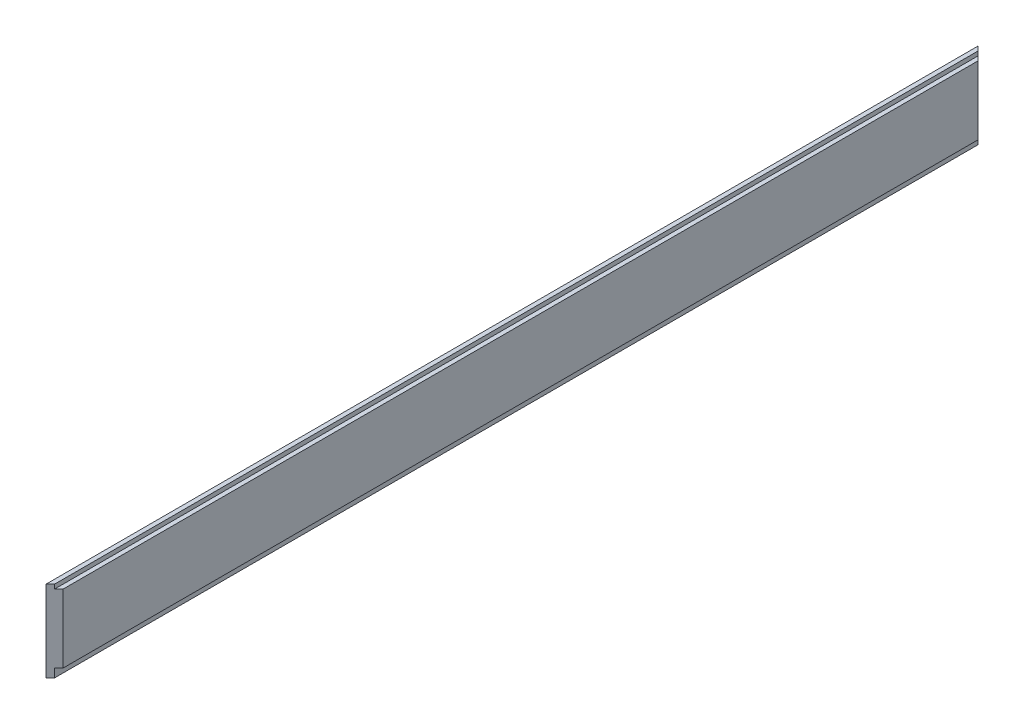
ISO-10303-21;
HEADER;
FILE_DESCRIPTION(('STEP AP214'),'2;1');
FILE_NAME('part.step','',(''),(''),'','','');
FILE_SCHEMA(('AUTOMOTIVE_DESIGN { 1 0 10303 214 1 1 1 1 }'));
ENDSEC;
DATA;
#1=APPLICATION_CONTEXT('core data for automotive mechanical design processes');
#2=APPLICATION_PROTOCOL_DEFINITION('international standard','automotive_design',2000,#1);
#3=PRODUCT_CONTEXT('',#1,'mechanical');
#4=PRODUCT('Part','Part','',(#3));
#5=PRODUCT_RELATED_PRODUCT_CATEGORY('part','',(#4));
#6=PRODUCT_DEFINITION_FORMATION('','',#4);
#7=PRODUCT_DEFINITION_CONTEXT('part definition',#1,'design');
#8=PRODUCT_DEFINITION('design','',#6,#7);
#9=PRODUCT_DEFINITION_SHAPE('','',#8);
#10=(LENGTH_UNIT() NAMED_UNIT(*) SI_UNIT(.MILLI.,.METRE.));
#11=(NAMED_UNIT(*) PLANE_ANGLE_UNIT() SI_UNIT($,.RADIAN.));
#12=(NAMED_UNIT(*) SI_UNIT($,.STERADIAN.) SOLID_ANGLE_UNIT());
#13=UNCERTAINTY_MEASURE_WITH_UNIT(LENGTH_MEASURE(1.E-05),#10,'distance_accuracy_value','');
#14=(GEOMETRIC_REPRESENTATION_CONTEXT(3) GLOBAL_UNCERTAINTY_ASSIGNED_CONTEXT((#13)) GLOBAL_UNIT_ASSIGNED_CONTEXT((#10,
#11,#12)) REPRESENTATION_CONTEXT('',''));
#15=CARTESIAN_POINT('',(0.,0.,0.));
#16=DIRECTION('',(0.,0.,1.));
#17=DIRECTION('',(1.,0.,0.));
#18=AXIS2_PLACEMENT_3D('',#15,#16,#17);
#19=CARTESIAN_POINT('',(3.175,0.,692.15));
#20=DIRECTION('',(0.,-1.,0.));
#21=DIRECTION('',(1.,0.,0.));
#22=AXIS2_PLACEMENT_3D('',#19,#20,#21);
#23=PLANE('',#22);
#24=DIRECTION('',(0.,0.,-1.));
#25=VECTOR('',#24,1.);
#26=CARTESIAN_POINT('',(3.175,0.,692.15));
#27=LINE('',#26,#25);
#28=CARTESIAN_POINT('',(3.175,0.,688.975));
#29=VERTEX_POINT('',#28);
#30=CARTESIAN_POINT('',(3.17500000000001,0.,3.17500000000004));
#31=VERTEX_POINT('',#30);
#32=EDGE_CURVE('E11',#29,#31,#27,.T.);
#33=ORIENTED_EDGE('',*,*,#32,.F.);
#34=DIRECTION('',(0.707106781186547,0.,-0.707106781186548));
#35=VECTOR('',#34,1.);
#36=CARTESIAN_POINT('',(0.,0.,692.15));
#37=LINE('',#36,#35);
#38=CARTESIAN_POINT('',(0.,0.,692.15));
#39=VERTEX_POINT('',#38);
#40=EDGE_CURVE('E102',#39,#29,#37,.T.);
#41=ORIENTED_EDGE('',*,*,#40,.F.);
#42=DIRECTION('',(0.,0.,-1.));
#43=VECTOR('',#42,1.);
#44=CARTESIAN_POINT('',(0.,0.,692.15));
#45=LINE('',#44,#43);
#46=CARTESIAN_POINT('',(0.,0.,0.));
#47=VERTEX_POINT('',#46);
#48=EDGE_CURVE('E42',#39,#47,#45,.T.);
#49=ORIENTED_EDGE('',*,*,#48,.T.);
#50=DIRECTION('',(0.707106781186547,0.,0.707106781186548));
#51=VECTOR('',#50,1.);
#52=CARTESIAN_POINT('',(0.,0.,0.));
#53=LINE('',#52,#51);
#54=EDGE_CURVE('E159',#47,#31,#53,.T.);
#55=ORIENTED_EDGE('',*,*,#54,.T.);
#56=EDGE_LOOP('',(#33,#41,#49,#55));
#57=FACE_BOUND('',#56,.T.);
#58=ADVANCED_FACE('F39',(#57),#23,.T.);
#59=CARTESIAN_POINT('',(3.175,6.35,692.15));
#60=DIRECTION('',(1.,0.,0.));
#61=DIRECTION('',(0.,1.,0.));
#62=AXIS2_PLACEMENT_3D('',#59,#60,#61);
#63=PLANE('',#62);
#64=DIRECTION('',(0.,0.,-1.));
#65=VECTOR('',#64,1.);
#66=CARTESIAN_POINT('',(3.175,6.35,692.15));
#67=LINE('',#66,#65);
#68=CARTESIAN_POINT('',(3.175,6.35,688.975));
#69=VERTEX_POINT('',#68);
#70=CARTESIAN_POINT('',(3.17500000000004,6.35,3.17499999999998));
#71=VERTEX_POINT('',#70);
#72=EDGE_CURVE('E49',#69,#71,#67,.T.);
#73=ORIENTED_EDGE('',*,*,#72,.F.);
#74=DIRECTION('',(0.,-1.,0.));
#75=VECTOR('',#74,1.);
#76=CARTESIAN_POINT('',(3.175,6.35,688.975));
#77=LINE('',#76,#75);
#78=EDGE_CURVE('E164',#69,#29,#77,.T.);
#79=ORIENTED_EDGE('',*,*,#78,.T.);
#80=ORIENTED_EDGE('',*,*,#32,.T.);
#81=DIRECTION('',(0.,-1.,0.));
#82=VECTOR('',#81,1.);
#83=CARTESIAN_POINT('',(3.175,6.34999999999995,3.17500000000004));
#84=LINE('',#83,#82);
#85=EDGE_CURVE('E138',#71,#31,#84,.T.);
#86=ORIENTED_EDGE('',*,*,#85,.F.);
#87=EDGE_LOOP('',(#73,#79,#80,#86));
#88=FACE_BOUND('',#87,.T.);
#89=ADVANCED_FACE('F209',(#88),#63,.T.);
#90=CARTESIAN_POINT('',(6.35,6.35,692.15));
#91=DIRECTION('',(0.,-1.,0.));
#92=DIRECTION('',(1.,0.,0.));
#93=AXIS2_PLACEMENT_3D('',#90,#91,#92);
#94=PLANE('',#93);
#95=DIRECTION('',(0.,0.,-1.));
#96=VECTOR('',#95,1.);
#97=CARTESIAN_POINT('',(6.35,6.35,692.15));
#98=LINE('',#97,#96);
#99=CARTESIAN_POINT('',(6.34999999999999,6.35,685.8));
#100=VERTEX_POINT('',#99);
#101=CARTESIAN_POINT('',(6.34999999999999,6.35,6.35));
#102=VERTEX_POINT('',#101);
#103=EDGE_CURVE('E132',#100,#102,#98,.T.);
#104=ORIENTED_EDGE('',*,*,#103,.F.);
#105=DIRECTION('',(-0.707106781186547,0.,0.707106781186548));
#106=VECTOR('',#105,1.);
#107=CARTESIAN_POINT('',(3.175,6.35,688.975));
#108=LINE('',#107,#106);
#109=EDGE_CURVE('E169',#100,#69,#108,.T.);
#110=ORIENTED_EDGE('',*,*,#109,.T.);
#111=ORIENTED_EDGE('',*,*,#72,.T.);
#112=DIRECTION('',(-0.707106781186547,0.,-0.707106781186548));
#113=VECTOR('',#112,1.);
#114=CARTESIAN_POINT('',(349.25,6.35000000000009,349.25));
#115=LINE('',#114,#113);
#116=EDGE_CURVE('E143',#102,#71,#115,.T.);
#117=ORIENTED_EDGE('',*,*,#116,.F.);
#118=EDGE_LOOP('',(#104,#110,#111,#117));
#119=FACE_BOUND('',#118,.T.);
#120=ADVANCED_FACE('F206',(#119),#94,.T.);
#121=CARTESIAN_POINT('',(6.34999999999999,57.15,692.15));
#122=DIRECTION('',(1.,0.,0.));
#123=DIRECTION('',(0.,1.,0.));
#124=AXIS2_PLACEMENT_3D('',#121,#122,#123);
#125=PLANE('',#124);
#126=DIRECTION('',(0.,0.,-1.));
#127=VECTOR('',#126,1.);
#128=CARTESIAN_POINT('',(6.34999999999999,57.15,692.15));
#129=LINE('',#128,#127);
#130=CARTESIAN_POINT('',(6.34999999999999,57.15,685.8));
#131=VERTEX_POINT('',#130);
#132=CARTESIAN_POINT('',(6.34999999999999,57.15,6.35));
#133=VERTEX_POINT('',#132);
#134=EDGE_CURVE('E129',#131,#133,#129,.T.);
#135=ORIENTED_EDGE('',*,*,#134,.F.);
#136=DIRECTION('',(0.,1.,0.));
#137=VECTOR('',#136,1.);
#138=CARTESIAN_POINT('',(6.34999999999999,0.,685.8));
#139=LINE('',#138,#137);
#140=EDGE_CURVE('E116',#100,#131,#139,.T.);
#141=ORIENTED_EDGE('',*,*,#140,.F.);
#142=ORIENTED_EDGE('',*,*,#103,.T.);
#143=DIRECTION('',(0.,1.,0.));
#144=VECTOR('',#143,1.);
#145=CARTESIAN_POINT('',(6.34999999999999,0.,6.35));
#146=LINE('',#145,#144);
#147=EDGE_CURVE('E155',#102,#133,#146,.T.);
#148=ORIENTED_EDGE('',*,*,#147,.T.);
#149=EDGE_LOOP('',(#135,#141,#142,#148));
#150=FACE_BOUND('',#149,.T.);
#151=ADVANCED_FACE('F201',(#150),#125,.T.);
#152=CARTESIAN_POINT('',(3.17499999999999,57.15,692.15));
#153=DIRECTION('',(0.,1.,0.));
#154=DIRECTION('',(0.,0.,1.));
#155=AXIS2_PLACEMENT_3D('',#152,#153,#154);
#156=PLANE('',#155);
#157=DIRECTION('',(0.,0.,-1.));
#158=VECTOR('',#157,1.);
#159=CARTESIAN_POINT('',(3.17499999999999,57.15,692.15));
#160=LINE('',#159,#158);
#161=CARTESIAN_POINT('',(3.17499999999999,57.15,688.975));
#162=VERTEX_POINT('',#161);
#163=CARTESIAN_POINT('',(3.17499999999999,57.15,3.17500000000004));
#164=VERTEX_POINT('',#163);
#165=EDGE_CURVE('E124',#162,#164,#160,.T.);
#166=ORIENTED_EDGE('',*,*,#165,.F.);
#167=DIRECTION('',(0.707106781186547,0.,-0.707106781186548));
#168=VECTOR('',#167,1.);
#169=CARTESIAN_POINT('',(1.5875,57.15,690.5625));
#170=LINE('',#169,#168);
#171=EDGE_CURVE('E173',#162,#131,#170,.T.);
#172=ORIENTED_EDGE('',*,*,#171,.T.);
#173=ORIENTED_EDGE('',*,*,#134,.T.);
#174=DIRECTION('',(0.707106781186547,0.,0.707106781186548));
#175=VECTOR('',#174,1.);
#176=CARTESIAN_POINT('',(347.6625,57.15,347.6625));
#177=LINE('',#176,#175);
#178=EDGE_CURVE('E147',#164,#133,#177,.T.);
#179=ORIENTED_EDGE('',*,*,#178,.F.);
#180=EDGE_LOOP('',(#166,#172,#173,#179));
#181=FACE_BOUND('',#180,.T.);
#182=ADVANCED_FACE('F197',(#181),#156,.T.);
#183=CARTESIAN_POINT('',(3.17499999999999,60.325,692.15));
#184=DIRECTION('',(1.,0.,0.));
#185=DIRECTION('',(0.,1.,0.));
#186=AXIS2_PLACEMENT_3D('',#183,#184,#185);
#187=PLANE('',#186);
#188=DIRECTION('',(0.,0.,-1.));
#189=VECTOR('',#188,1.);
#190=CARTESIAN_POINT('',(3.17499999999999,60.325,692.15));
#191=LINE('',#190,#189);
#192=CARTESIAN_POINT('',(3.17500000000001,60.325,688.975));
#193=VERTEX_POINT('',#192);
#194=CARTESIAN_POINT('',(3.17499999999998,60.325,3.17499999999999));
#195=VERTEX_POINT('',#194);
#196=EDGE_CURVE('E122',#193,#195,#191,.T.);
#197=ORIENTED_EDGE('',*,*,#196,.F.);
#198=DIRECTION('',(0.,-1.,0.));
#199=VECTOR('',#198,1.);
#200=CARTESIAN_POINT('',(3.17499999999999,60.325,688.975));
#201=LINE('',#200,#199);
#202=EDGE_CURVE('E177',#193,#162,#201,.T.);
#203=ORIENTED_EDGE('',*,*,#202,.T.);
#204=ORIENTED_EDGE('',*,*,#165,.T.);
#205=DIRECTION('',(0.,-1.,0.));
#206=VECTOR('',#205,1.);
#207=CARTESIAN_POINT('',(3.17499999999999,60.3249999999999,3.17500000000004));
#208=LINE('',#207,#206);
#209=EDGE_CURVE('E151',#195,#164,#208,.T.);
#210=ORIENTED_EDGE('',*,*,#209,.F.);
#211=EDGE_LOOP('',(#197,#203,#204,#210));
#212=FACE_BOUND('',#211,.T.);
#213=ADVANCED_FACE('F190',(#212),#187,.T.);
#214=CARTESIAN_POINT('',(0.,60.325,692.15));
#215=DIRECTION('',(0.,1.,0.));
#216=DIRECTION('',(0.,0.,1.));
#217=AXIS2_PLACEMENT_3D('',#214,#215,#216);
#218=PLANE('',#217);
#219=DIRECTION('',(0.,0.,-1.));
#220=VECTOR('',#219,1.);
#221=CARTESIAN_POINT('',(0.,60.325,692.15));
#222=LINE('',#221,#220);
#223=CARTESIAN_POINT('',(0.,60.325,692.15));
#224=VERTEX_POINT('',#223);
#225=CARTESIAN_POINT('',(0.,60.325,0.));
#226=VERTEX_POINT('',#225);
#227=EDGE_CURVE('E120',#224,#226,#222,.T.);
#228=ORIENTED_EDGE('',*,*,#227,.F.);
#229=DIRECTION('',(0.707106781186547,0.,-0.707106781186548));
#230=VECTOR('',#229,1.);
#231=CARTESIAN_POINT('',(0.,60.325,692.15));
#232=LINE('',#231,#230);
#233=EDGE_CURVE('E56',#224,#193,#232,.T.);
#234=ORIENTED_EDGE('',*,*,#233,.T.);
#235=ORIENTED_EDGE('',*,*,#196,.T.);
#236=DIRECTION('',(0.707106781186547,0.,0.707106781186548));
#237=VECTOR('',#236,1.);
#238=CARTESIAN_POINT('',(0.,60.325,0.));
#239=LINE('',#238,#237);
#240=EDGE_CURVE('E160',#226,#195,#239,.T.);
#241=ORIENTED_EDGE('',*,*,#240,.F.);
#242=EDGE_LOOP('',(#228,#234,#235,#241));
#243=FACE_BOUND('',#242,.T.);
#244=ADVANCED_FACE('F186',(#243),#218,.T.);
#245=CARTESIAN_POINT('',(0.,0.,692.15));
#246=DIRECTION('',(-1.,0.,0.));
#247=DIRECTION('',(0.,0.,1.));
#248=AXIS2_PLACEMENT_3D('',#245,#246,#247);
#249=PLANE('',#248);
#250=DIRECTION('',(0.,1.,0.));
#251=VECTOR('',#250,1.);
#252=CARTESIAN_POINT('',(0.,0.,0.));
#253=LINE('',#252,#251);
#254=EDGE_CURVE('E108',#47,#226,#253,.T.);
#255=ORIENTED_EDGE('',*,*,#254,.F.);
#256=ORIENTED_EDGE('',*,*,#48,.F.);
#257=DIRECTION('',(0.,1.,0.));
#258=VECTOR('',#257,1.);
#259=CARTESIAN_POINT('',(0.,0.,692.15));
#260=LINE('',#259,#258);
#261=EDGE_CURVE('E99',#39,#224,#260,.T.);
#262=ORIENTED_EDGE('',*,*,#261,.T.);
#263=ORIENTED_EDGE('',*,*,#227,.T.);
#264=EDGE_LOOP('',(#255,#256,#262,#263));
#265=FACE_BOUND('',#264,.T.);
#266=ADVANCED_FACE('F118',(#265),#249,.T.);
#267=CARTESIAN_POINT('',(0.,0.,0.));
#268=DIRECTION('',(-0.707106781186548,0.,0.707106781186547));
#269=DIRECTION('',(0.707106781186547,0.,0.707106781186548));
#270=AXIS2_PLACEMENT_3D('',#267,#268,#269);
#271=PLANE('',#270);
#272=ORIENTED_EDGE('',*,*,#85,.T.);
#273=ORIENTED_EDGE('',*,*,#54,.F.);
#274=ORIENTED_EDGE('',*,*,#254,.T.);
#275=ORIENTED_EDGE('',*,*,#240,.T.);
#276=ORIENTED_EDGE('',*,*,#209,.T.);
#277=ORIENTED_EDGE('',*,*,#178,.T.);
#278=ORIENTED_EDGE('',*,*,#147,.F.);
#279=ORIENTED_EDGE('',*,*,#116,.T.);
#280=EDGE_LOOP('',(#272,#273,#274,#275,#276,#277,#278,#279));
#281=FACE_BOUND('',#280,.T.);
#282=ADVANCED_FACE('F194',(#281),#271,.F.);
#283=CARTESIAN_POINT('',(0.,0.,692.15));
#284=DIRECTION('',(0.707106781186548,0.,0.707106781186547));
#285=DIRECTION('',(0.707106781186547,0.,-0.707106781186548));
#286=AXIS2_PLACEMENT_3D('',#283,#284,#285);
#287=PLANE('',#286);
#288=ORIENTED_EDGE('',*,*,#109,.F.);
#289=ORIENTED_EDGE('',*,*,#140,.T.);
#290=ORIENTED_EDGE('',*,*,#171,.F.);
#291=ORIENTED_EDGE('',*,*,#202,.F.);
#292=ORIENTED_EDGE('',*,*,#233,.F.);
#293=ORIENTED_EDGE('',*,*,#261,.F.);
#294=ORIENTED_EDGE('',*,*,#40,.T.);
#295=ORIENTED_EDGE('',*,*,#78,.F.);
#296=EDGE_LOOP('',(#288,#289,#290,#291,#292,#293,#294,#295));
#297=FACE_BOUND('',#296,.T.);
#298=ADVANCED_FACE('F101',(#297),#287,.T.);
#299=CLOSED_SHELL('',(#58,#89,#120,#151,#182,#213,#244,#266,#282,#298));
#300=MANIFOLD_SOLID_BREP('B2',#299);
#301=ADVANCED_BREP_SHAPE_REPRESENTATION('',(#18,#300),#14);
#302=SHAPE_DEFINITION_REPRESENTATION(#9,#301);
ENDSEC;
END-ISO-10303-21;
